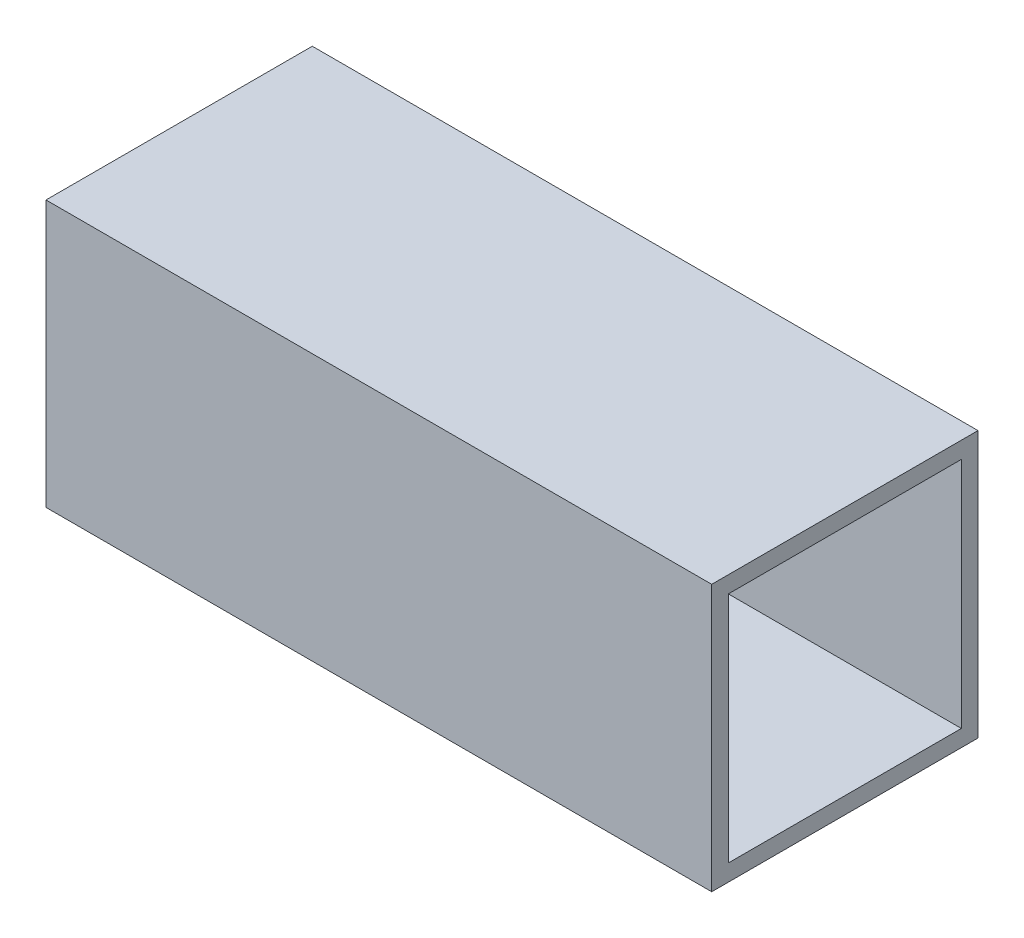
ISO-10303-21;
HEADER;
FILE_DESCRIPTION(('STEP AP214'),'2;1');
FILE_NAME('part.step','',(''),(''),'','','');
FILE_SCHEMA(('AUTOMOTIVE_DESIGN { 1 0 10303 214 1 1 1 1 }'));
ENDSEC;
DATA;
#1=APPLICATION_CONTEXT('core data for automotive mechanical design processes');
#2=APPLICATION_PROTOCOL_DEFINITION('international standard','automotive_design',2000,#1);
#3=PRODUCT_CONTEXT('',#1,'mechanical');
#4=PRODUCT('Part','Part','',(#3));
#5=PRODUCT_RELATED_PRODUCT_CATEGORY('part','',(#4));
#6=PRODUCT_DEFINITION_FORMATION('','',#4);
#7=PRODUCT_DEFINITION_CONTEXT('part definition',#1,'design');
#8=PRODUCT_DEFINITION('design','',#6,#7);
#9=PRODUCT_DEFINITION_SHAPE('','',#8);
#10=(LENGTH_UNIT() NAMED_UNIT(*) SI_UNIT(.MILLI.,.METRE.));
#11=(NAMED_UNIT(*) PLANE_ANGLE_UNIT() SI_UNIT($,.RADIAN.));
#12=(NAMED_UNIT(*) SI_UNIT($,.STERADIAN.) SOLID_ANGLE_UNIT());
#13=UNCERTAINTY_MEASURE_WITH_UNIT(LENGTH_MEASURE(1.E-05),#10,'distance_accuracy_value','');
#14=(GEOMETRIC_REPRESENTATION_CONTEXT(3) GLOBAL_UNCERTAINTY_ASSIGNED_CONTEXT((#13)) GLOBAL_UNIT_ASSIGNED_CONTEXT((#10,
#11,#12)) REPRESENTATION_CONTEXT('',''));
#15=CARTESIAN_POINT('',(0.,0.,0.));
#16=DIRECTION('',(0.,0.,1.));
#17=DIRECTION('',(1.,0.,0.));
#18=AXIS2_PLACEMENT_3D('',#15,#16,#17);
#19=CARTESIAN_POINT('',(100.,40.,0.));
#20=DIRECTION('',(-1.,0.,0.));
#21=DIRECTION('',(0.,0.,1.));
#22=AXIS2_PLACEMENT_3D('',#19,#20,#21);
#23=PLANE('',#22);
#24=DIRECTION('',(0.,-1.,0.));
#25=VECTOR('',#24,1.);
#26=CARTESIAN_POINT('',(100.,0.,0.));
#27=LINE('',#26,#25);
#28=CARTESIAN_POINT('',(100.,40.,0.));
#29=VERTEX_POINT('',#28);
#30=CARTESIAN_POINT('',(100.,0.,0.));
#31=VERTEX_POINT('',#30);
#32=EDGE_CURVE('E164',#29,#31,#27,.T.);
#33=ORIENTED_EDGE('',*,*,#32,.T.);
#34=DIRECTION('',(0.,0.,-1.));
#35=VECTOR('',#34,1.);
#36=CARTESIAN_POINT('',(100.,0.,0.));
#37=LINE('',#36,#35);
#38=CARTESIAN_POINT('',(100.,0.,-40.));
#39=VERTEX_POINT('',#38);
#40=EDGE_CURVE('E168',#31,#39,#37,.T.);
#41=ORIENTED_EDGE('',*,*,#40,.T.);
#42=DIRECTION('',(0.,1.,0.));
#43=VECTOR('',#42,1.);
#44=CARTESIAN_POINT('',(100.,0.,-40.));
#45=LINE('',#44,#43);
#46=CARTESIAN_POINT('',(100.,40.,-40.));
#47=VERTEX_POINT('',#46);
#48=EDGE_CURVE('E172',#39,#47,#45,.T.);
#49=ORIENTED_EDGE('',*,*,#48,.T.);
#50=DIRECTION('',(0.,0.,1.));
#51=VECTOR('',#50,1.);
#52=CARTESIAN_POINT('',(100.,40.,0.));
#53=LINE('',#52,#51);
#54=EDGE_CURVE('E175',#47,#29,#53,.T.);
#55=ORIENTED_EDGE('',*,*,#54,.T.);
#56=EDGE_LOOP('',(#33,#41,#49,#55));
#57=FACE_BOUND('',#56,.T.);
#58=DIRECTION('',(0.,-1.,0.));
#59=VECTOR('',#58,1.);
#60=CARTESIAN_POINT('',(100.,40.,-2.5));
#61=LINE('',#60,#59);
#62=CARTESIAN_POINT('',(100.,37.5,-2.5));
#63=VERTEX_POINT('',#62);
#64=CARTESIAN_POINT('',(100.,2.5,-2.5));
#65=VERTEX_POINT('',#64);
#66=EDGE_CURVE('E145',#63,#65,#61,.T.);
#67=ORIENTED_EDGE('',*,*,#66,.F.);
#68=DIRECTION('',(0.,0.,1.));
#69=VECTOR('',#68,1.);
#70=CARTESIAN_POINT('',(100.,37.5,0.));
#71=LINE('',#70,#69);
#72=CARTESIAN_POINT('',(100.,37.5,-37.5));
#73=VERTEX_POINT('',#72);
#74=EDGE_CURVE('E126',#73,#63,#71,.T.);
#75=ORIENTED_EDGE('',*,*,#74,.F.);
#76=DIRECTION('',(0.,1.,0.));
#77=VECTOR('',#76,1.);
#78=CARTESIAN_POINT('',(100.,40.,-37.5));
#79=LINE('',#78,#77);
#80=CARTESIAN_POINT('',(100.,2.5,-37.5));
#81=VERTEX_POINT('',#80);
#82=EDGE_CURVE('E159',#81,#73,#79,.T.);
#83=ORIENTED_EDGE('',*,*,#82,.F.);
#84=DIRECTION('',(0.,0.,-1.));
#85=VECTOR('',#84,1.);
#86=CARTESIAN_POINT('',(100.,2.5,0.));
#87=LINE('',#86,#85);
#88=EDGE_CURVE('E150',#65,#81,#87,.T.);
#89=ORIENTED_EDGE('',*,*,#88,.F.);
#90=EDGE_LOOP('',(#67,#75,#83,#89));
#91=FACE_BOUND('',#90,.T.);
#92=ADVANCED_FACE('F39',(#57,#91),#23,.F.);
#93=CARTESIAN_POINT('',(0.,40.,0.));
#94=DIRECTION('',(-1.,0.,0.));
#95=DIRECTION('',(0.,0.,1.));
#96=AXIS2_PLACEMENT_3D('',#93,#94,#95);
#97=PLANE('',#96);
#98=DIRECTION('',(0.,-1.,0.));
#99=VECTOR('',#98,1.);
#100=CARTESIAN_POINT('',(0.,0.,0.));
#101=LINE('',#100,#99);
#102=CARTESIAN_POINT('',(0.,40.,0.));
#103=VERTEX_POINT('',#102);
#104=CARTESIAN_POINT('',(0.,0.,0.));
#105=VERTEX_POINT('',#104);
#106=EDGE_CURVE('E179',#103,#105,#101,.T.);
#107=ORIENTED_EDGE('',*,*,#106,.F.);
#108=DIRECTION('',(0.,0.,1.));
#109=VECTOR('',#108,1.);
#110=CARTESIAN_POINT('',(0.,40.,0.));
#111=LINE('',#110,#109);
#112=CARTESIAN_POINT('',(0.,40.,-40.));
#113=VERTEX_POINT('',#112);
#114=EDGE_CURVE('E169',#113,#103,#111,.T.);
#115=ORIENTED_EDGE('',*,*,#114,.F.);
#116=DIRECTION('',(0.,1.,0.));
#117=VECTOR('',#116,1.);
#118=CARTESIAN_POINT('',(0.,0.,-40.));
#119=LINE('',#118,#117);
#120=CARTESIAN_POINT('',(0.,0.,-40.));
#121=VERTEX_POINT('',#120);
#122=EDGE_CURVE('E186',#121,#113,#119,.T.);
#123=ORIENTED_EDGE('',*,*,#122,.F.);
#124=DIRECTION('',(0.,0.,-1.));
#125=VECTOR('',#124,1.);
#126=CARTESIAN_POINT('',(0.,0.,0.));
#127=LINE('',#126,#125);
#128=EDGE_CURVE('E183',#105,#121,#127,.T.);
#129=ORIENTED_EDGE('',*,*,#128,.F.);
#130=EDGE_LOOP('',(#107,#115,#123,#129));
#131=FACE_BOUND('',#130,.T.);
#132=DIRECTION('',(0.,0.,1.));
#133=VECTOR('',#132,1.);
#134=CARTESIAN_POINT('',(0.,37.5,0.));
#135=LINE('',#134,#133);
#136=CARTESIAN_POINT('',(0.,37.5,-37.5));
#137=VERTEX_POINT('',#136);
#138=CARTESIAN_POINT('',(0.,37.5,-2.5));
#139=VERTEX_POINT('',#138);
#140=EDGE_CURVE('E124',#137,#139,#135,.T.);
#141=ORIENTED_EDGE('',*,*,#140,.T.);
#142=DIRECTION('',(0.,-1.,0.));
#143=VECTOR('',#142,1.);
#144=CARTESIAN_POINT('',(0.,40.,-2.5));
#145=LINE('',#144,#143);
#146=CARTESIAN_POINT('',(0.,2.5,-2.5));
#147=VERTEX_POINT('',#146);
#148=EDGE_CURVE('E133',#139,#147,#145,.T.);
#149=ORIENTED_EDGE('',*,*,#148,.T.);
#150=DIRECTION('',(0.,0.,-1.));
#151=VECTOR('',#150,1.);
#152=CARTESIAN_POINT('',(0.,2.5,0.));
#153=LINE('',#152,#151);
#154=CARTESIAN_POINT('',(0.,2.5,-37.5));
#155=VERTEX_POINT('',#154);
#156=EDGE_CURVE('E140',#147,#155,#153,.T.);
#157=ORIENTED_EDGE('',*,*,#156,.T.);
#158=DIRECTION('',(0.,1.,0.));
#159=VECTOR('',#158,1.);
#160=CARTESIAN_POINT('',(0.,40.,-37.5));
#161=LINE('',#160,#159);
#162=EDGE_CURVE('E68',#155,#137,#161,.T.);
#163=ORIENTED_EDGE('',*,*,#162,.T.);
#164=EDGE_LOOP('',(#141,#149,#157,#163));
#165=FACE_BOUND('',#164,.T.);
#166=ADVANCED_FACE('F143',(#131,#165),#97,.T.);
#167=CARTESIAN_POINT('',(100.,0.,0.));
#168=DIRECTION('',(0.,0.,-1.));
#169=DIRECTION('',(-1.,0.,0.));
#170=AXIS2_PLACEMENT_3D('',#167,#168,#169);
#171=PLANE('',#170);
#172=ORIENTED_EDGE('',*,*,#106,.T.);
#173=DIRECTION('',(-1.,0.,0.));
#174=VECTOR('',#173,1.);
#175=CARTESIAN_POINT('',(100.,0.,0.));
#176=LINE('',#175,#174);
#177=EDGE_CURVE('E11',#31,#105,#176,.T.);
#178=ORIENTED_EDGE('',*,*,#177,.F.);
#179=ORIENTED_EDGE('',*,*,#32,.F.);
#180=DIRECTION('',(-1.,0.,0.));
#181=VECTOR('',#180,1.);
#182=CARTESIAN_POINT('',(100.,40.,0.));
#183=LINE('',#182,#181);
#184=EDGE_CURVE('E178',#29,#103,#183,.T.);
#185=ORIENTED_EDGE('',*,*,#184,.T.);
#186=EDGE_LOOP('',(#172,#178,#179,#185));
#187=FACE_BOUND('',#186,.T.);
#188=ADVANCED_FACE('F41',(#187),#171,.F.);
#189=CARTESIAN_POINT('',(100.,0.,0.));
#190=DIRECTION('',(0.,1.,0.));
#191=DIRECTION('',(0.,0.,1.));
#192=AXIS2_PLACEMENT_3D('',#189,#190,#191);
#193=PLANE('',#192);
#194=ORIENTED_EDGE('',*,*,#128,.T.);
#195=DIRECTION('',(-1.,0.,0.));
#196=VECTOR('',#195,1.);
#197=CARTESIAN_POINT('',(100.,0.,-40.));
#198=LINE('',#197,#196);
#199=EDGE_CURVE('E48',#39,#121,#198,.T.);
#200=ORIENTED_EDGE('',*,*,#199,.F.);
#201=ORIENTED_EDGE('',*,*,#40,.F.);
#202=ORIENTED_EDGE('',*,*,#177,.T.);
#203=EDGE_LOOP('',(#194,#200,#201,#202));
#204=FACE_BOUND('',#203,.T.);
#205=ADVANCED_FACE('F217',(#204),#193,.F.);
#206=CARTESIAN_POINT('',(100.,0.,-40.));
#207=DIRECTION('',(0.,0.,1.));
#208=DIRECTION('',(1.,0.,0.));
#209=AXIS2_PLACEMENT_3D('',#206,#207,#208);
#210=PLANE('',#209);
#211=CARTESIAN_POINT('',(50.,20.,-40.));
#212=DIRECTION('',(0.,0.,-1.));
#213=DIRECTION('',(-1.,0.,0.));
#214=AXIS2_PLACEMENT_3D('',#211,#212,#213);
#215=CIRCLE('',#214,6.00000000000001);
#216=CARTESIAN_POINT('',(44.,20.,-40.));
#217=VERTEX_POINT('',#216);
#218=EDGE_CURVE('E257',#217,#217,#215,.T.);
#219=ORIENTED_EDGE('',*,*,#218,.F.);
#220=EDGE_LOOP('',(#219));
#221=FACE_BOUND('',#220,.T.);
#222=ORIENTED_EDGE('',*,*,#122,.T.);
#223=DIRECTION('',(-1.,0.,0.));
#224=VECTOR('',#223,1.);
#225=CARTESIAN_POINT('',(100.,40.,-40.));
#226=LINE('',#225,#224);
#227=EDGE_CURVE('E194',#47,#113,#226,.T.);
#228=ORIENTED_EDGE('',*,*,#227,.F.);
#229=ORIENTED_EDGE('',*,*,#48,.F.);
#230=ORIENTED_EDGE('',*,*,#199,.T.);
#231=EDGE_LOOP('',(#222,#228,#229,#230));
#232=FACE_BOUND('',#231,.T.);
#233=ADVANCED_FACE('F202',(#221,#232),#210,.F.);
#234=CARTESIAN_POINT('',(100.,40.,0.));
#235=DIRECTION('',(0.,-1.,0.));
#236=DIRECTION('',(0.,0.,-1.));
#237=AXIS2_PLACEMENT_3D('',#234,#235,#236);
#238=PLANE('',#237);
#239=ORIENTED_EDGE('',*,*,#114,.T.);
#240=ORIENTED_EDGE('',*,*,#184,.F.);
#241=ORIENTED_EDGE('',*,*,#54,.F.);
#242=ORIENTED_EDGE('',*,*,#227,.T.);
#243=EDGE_LOOP('',(#239,#240,#241,#242));
#244=FACE_BOUND('',#243,.T.);
#245=ADVANCED_FACE('F210',(#244),#238,.F.);
#246=CARTESIAN_POINT('',(100.,0.,-2.5));
#247=DIRECTION('',(0.,0.,-1.));
#248=DIRECTION('',(-1.,0.,0.));
#249=AXIS2_PLACEMENT_3D('',#246,#247,#248);
#250=PLANE('',#249);
#251=ORIENTED_EDGE('',*,*,#148,.F.);
#252=DIRECTION('',(-1.,0.,0.));
#253=VECTOR('',#252,1.);
#254=CARTESIAN_POINT('',(100.,37.5,-2.5));
#255=LINE('',#254,#253);
#256=EDGE_CURVE('E120',#63,#139,#255,.T.);
#257=ORIENTED_EDGE('',*,*,#256,.F.);
#258=ORIENTED_EDGE('',*,*,#66,.T.);
#259=DIRECTION('',(-1.,0.,0.));
#260=VECTOR('',#259,1.);
#261=CARTESIAN_POINT('',(100.,2.5,-2.5));
#262=LINE('',#261,#260);
#263=EDGE_CURVE('E136',#65,#147,#262,.T.);
#264=ORIENTED_EDGE('',*,*,#263,.T.);
#265=EDGE_LOOP('',(#251,#257,#258,#264));
#266=FACE_BOUND('',#265,.T.);
#267=ADVANCED_FACE('F134',(#266),#250,.T.);
#268=CARTESIAN_POINT('',(100.,2.5,0.));
#269=DIRECTION('',(0.,1.,0.));
#270=DIRECTION('',(0.,0.,1.));
#271=AXIS2_PLACEMENT_3D('',#268,#269,#270);
#272=PLANE('',#271);
#273=ORIENTED_EDGE('',*,*,#156,.F.);
#274=ORIENTED_EDGE('',*,*,#263,.F.);
#275=ORIENTED_EDGE('',*,*,#88,.T.);
#276=DIRECTION('',(-1.,0.,0.));
#277=VECTOR('',#276,1.);
#278=CARTESIAN_POINT('',(100.,2.5,-37.5));
#279=LINE('',#278,#277);
#280=EDGE_CURVE('E264',#81,#155,#279,.T.);
#281=ORIENTED_EDGE('',*,*,#280,.T.);
#282=EDGE_LOOP('',(#273,#274,#275,#281));
#283=FACE_BOUND('',#282,.T.);
#284=ADVANCED_FACE('F238',(#283),#272,.T.);
#285=CARTESIAN_POINT('',(100.,0.,-37.5));
#286=DIRECTION('',(0.,0.,1.));
#287=DIRECTION('',(1.,0.,0.));
#288=AXIS2_PLACEMENT_3D('',#285,#286,#287);
#289=PLANE('',#288);
#290=CARTESIAN_POINT('',(50.,20.,-37.5));
#291=DIRECTION('',(0.,0.,1.));
#292=DIRECTION('',(1.,0.,0.));
#293=AXIS2_PLACEMENT_3D('',#290,#291,#292);
#294=CIRCLE('',#293,6.00000000000001);
#295=CARTESIAN_POINT('',(44.,20.,-37.5));
#296=VERTEX_POINT('',#295);
#297=EDGE_CURVE('E141',#296,#296,#294,.F.);
#298=ORIENTED_EDGE('',*,*,#297,.T.);
#299=EDGE_LOOP('',(#298));
#300=FACE_BOUND('',#299,.T.);
#301=ORIENTED_EDGE('',*,*,#162,.F.);
#302=ORIENTED_EDGE('',*,*,#280,.F.);
#303=ORIENTED_EDGE('',*,*,#82,.T.);
#304=DIRECTION('',(-1.,0.,0.));
#305=VECTOR('',#304,1.);
#306=CARTESIAN_POINT('',(100.,37.5,-37.5));
#307=LINE('',#306,#305);
#308=EDGE_CURVE('E58',#73,#137,#307,.T.);
#309=ORIENTED_EDGE('',*,*,#308,.T.);
#310=EDGE_LOOP('',(#301,#302,#303,#309));
#311=FACE_BOUND('',#310,.T.);
#312=ADVANCED_FACE('F243',(#300,#311),#289,.T.);
#313=CARTESIAN_POINT('',(100.,37.5,0.));
#314=DIRECTION('',(0.,-1.,0.));
#315=DIRECTION('',(0.,0.,-1.));
#316=AXIS2_PLACEMENT_3D('',#313,#314,#315);
#317=PLANE('',#316);
#318=ORIENTED_EDGE('',*,*,#140,.F.);
#319=ORIENTED_EDGE('',*,*,#308,.F.);
#320=ORIENTED_EDGE('',*,*,#74,.T.);
#321=ORIENTED_EDGE('',*,*,#256,.T.);
#322=EDGE_LOOP('',(#318,#319,#320,#321));
#323=FACE_BOUND('',#322,.T.);
#324=ADVANCED_FACE('F122',(#323),#317,.T.);
#325=CARTESIAN_POINT('',(50.,20.,-20.5294372515228));
#326=DIRECTION('',(0.,0.,-1.));
#327=DIRECTION('',(-1.,0.,0.));
#328=AXIS2_PLACEMENT_3D('',#325,#326,#327);
#329=CYLINDRICAL_SURFACE('',#328,6.00000000000001);
#330=CARTESIAN_POINT('',(44.,20.,-40.));
#331=CARTESIAN_POINT('',(44.,20.,-39.9739583333333));
#332=CARTESIAN_POINT('',(44.,20.,-39.9479166666667));
#333=CARTESIAN_POINT('',(44.,20.,-39.8958333333333));
#334=CARTESIAN_POINT('',(44.,20.,-39.8697916666667));
#335=CARTESIAN_POINT('',(44.,20.,-39.8177083333333));
#336=CARTESIAN_POINT('',(44.,20.,-39.7916666666667));
#337=CARTESIAN_POINT('',(44.,20.,-39.7395833333333));
#338=CARTESIAN_POINT('',(44.,20.,-39.7135416666667));
#339=CARTESIAN_POINT('',(44.,20.,-39.6614583333333));
#340=CARTESIAN_POINT('',(44.,20.,-39.6354166666667));
#341=CARTESIAN_POINT('',(44.,20.,-39.5833333333333));
#342=CARTESIAN_POINT('',(44.,20.,-39.5572916666667));
#343=CARTESIAN_POINT('',(44.,20.,-39.5052083333333));
#344=CARTESIAN_POINT('',(44.,20.,-39.4791666666667));
#345=CARTESIAN_POINT('',(44.,20.,-39.4270833333333));
#346=CARTESIAN_POINT('',(44.,20.,-39.4010416666667));
#347=CARTESIAN_POINT('',(44.,20.,-39.3489583333333));
#348=CARTESIAN_POINT('',(44.,20.,-39.3229166666667));
#349=CARTESIAN_POINT('',(44.,20.,-39.2708333333333));
#350=CARTESIAN_POINT('',(44.,20.,-39.2447916666667));
#351=CARTESIAN_POINT('',(44.,20.,-39.1927083333333));
#352=CARTESIAN_POINT('',(44.,20.,-39.1666666666667));
#353=CARTESIAN_POINT('',(44.,20.,-39.1145833333333));
#354=CARTESIAN_POINT('',(44.,20.,-39.0885416666667));
#355=CARTESIAN_POINT('',(44.,20.,-39.0364583333333));
#356=CARTESIAN_POINT('',(44.,20.,-39.0104166666667));
#357=CARTESIAN_POINT('',(44.,20.,-38.9583333333333));
#358=CARTESIAN_POINT('',(44.,20.,-38.9322916666667));
#359=CARTESIAN_POINT('',(44.,20.,-38.8802083333333));
#360=CARTESIAN_POINT('',(44.,20.,-38.8541666666667));
#361=CARTESIAN_POINT('',(44.,20.,-38.8020833333333));
#362=CARTESIAN_POINT('',(44.,20.,-38.7760416666667));
#363=CARTESIAN_POINT('',(44.,20.,-38.7239583333333));
#364=CARTESIAN_POINT('',(44.,20.,-38.6979166666667));
#365=CARTESIAN_POINT('',(44.,20.,-38.6458333333333));
#366=CARTESIAN_POINT('',(44.,20.,-38.6197916666667));
#367=CARTESIAN_POINT('',(44.,20.,-38.5677083333333));
#368=CARTESIAN_POINT('',(44.,20.,-38.5416666666667));
#369=CARTESIAN_POINT('',(44.,20.,-38.4895833333333));
#370=CARTESIAN_POINT('',(44.,20.,-38.4635416666667));
#371=CARTESIAN_POINT('',(44.,20.,-38.4114583333333));
#372=CARTESIAN_POINT('',(44.,20.,-38.3854166666667));
#373=CARTESIAN_POINT('',(44.,20.,-38.3333333333333));
#374=CARTESIAN_POINT('',(44.,20.,-38.3072916666667));
#375=CARTESIAN_POINT('',(44.,20.,-38.2552083333333));
#376=CARTESIAN_POINT('',(44.,20.,-38.2291666666667));
#377=CARTESIAN_POINT('',(44.,20.,-38.1770833333333));
#378=CARTESIAN_POINT('',(44.,20.,-38.1510416666667));
#379=CARTESIAN_POINT('',(44.,20.,-38.0989583333333));
#380=CARTESIAN_POINT('',(44.,20.,-38.0729166666667));
#381=CARTESIAN_POINT('',(44.,20.,-38.0208333333333));
#382=CARTESIAN_POINT('',(44.,20.,-37.9947916666667));
#383=CARTESIAN_POINT('',(44.,20.,-37.9427083333333));
#384=CARTESIAN_POINT('',(44.,20.,-37.9166666666667));
#385=CARTESIAN_POINT('',(44.,20.,-37.8645833333333));
#386=CARTESIAN_POINT('',(44.,20.,-37.8385416666667));
#387=CARTESIAN_POINT('',(44.,20.,-37.7864583333333));
#388=CARTESIAN_POINT('',(44.,20.,-37.7604166666667));
#389=CARTESIAN_POINT('',(44.,20.,-37.7083333333333));
#390=CARTESIAN_POINT('',(44.,20.,-37.6822916666667));
#391=CARTESIAN_POINT('',(44.,20.,-37.6302083333333));
#392=CARTESIAN_POINT('',(44.,20.,-37.6041666666667));
#393=CARTESIAN_POINT('',(44.,20.,-37.5520833333333));
#394=CARTESIAN_POINT('',(44.,20.,-37.5260416666667));
#395=CARTESIAN_POINT('',(44.,20.,-37.5));
#396=B_SPLINE_CURVE_WITH_KNOTS('',3,(#330,#331,#332,#333,#334,#335,#336,#337,#338,#339,#340,
#341,#342,#343,#344,#345,#346,#347,#348,#349,#350,#351,#352,#353,#354,#355,#356,#357,#358,#359,
#360,#361,#362,#363,#364,#365,#366,#367,#368,#369,#370,#371,#372,#373,#374,#375,#376,#377,#378,
#379,#380,#381,#382,#383,#384,#385,#386,#387,#388,#389,#390,#391,#392,#393,#394,#395),
.UNSPECIFIED.,.F.,.F.,(4,2,2,2,2,2,2,2,2,2,2,2,2,2,2,2,2,2,2,2,2,2,2,2,2,2,2,2,2,2,2,2,4),(0.,
0.0781249999999983,0.156249999999997,0.234374999999995,0.312499999999993,0.390624999999992,
0.468749999999997,0.546874999999995,0.625000000000001,0.703124999999999,0.781249999999997,
0.859374999999996,0.937499999999994,1.01562499999999,1.09374999999999,1.171875,1.24999999999999,
1.32812499999999,1.40625,1.484375,1.56249999999999,1.64062499999999,1.71874999999999,
1.79687499999999,1.87499999999999,1.95312499999999,2.03124999999999,2.109375,2.1875,
2.26562499999999,2.34374999999999,2.42187499999999,2.49999999999999),.UNSPECIFIED.);
#397=EDGE_CURVE('BSEAM247',#217,#296,#396,.T.);
#398=ORIENTED_EDGE('',*,*,#218,.T.);
#399=ORIENTED_EDGE('',*,*,#297,.F.);
#400=ORIENTED_EDGE('',*,*,#397,.T.);
#401=ORIENTED_EDGE('',*,*,#397,.F.);
#402=EDGE_LOOP('',(#398,#400,#399,#401));
#403=FACE_BOUND('',#402,.T.);
#404=ADVANCED_FACE('F247',(#403),#329,.F.);
#405=CLOSED_SHELL('',(#92,#166,#188,#205,#233,#245,#267,#284,#312,#324,#404));
#406=MANIFOLD_SOLID_BREP('B2',#405);
#407=ADVANCED_BREP_SHAPE_REPRESENTATION('',(#18,#406),#14);
#408=SHAPE_DEFINITION_REPRESENTATION(#9,#407);
ENDSEC;
END-ISO-10303-21;
